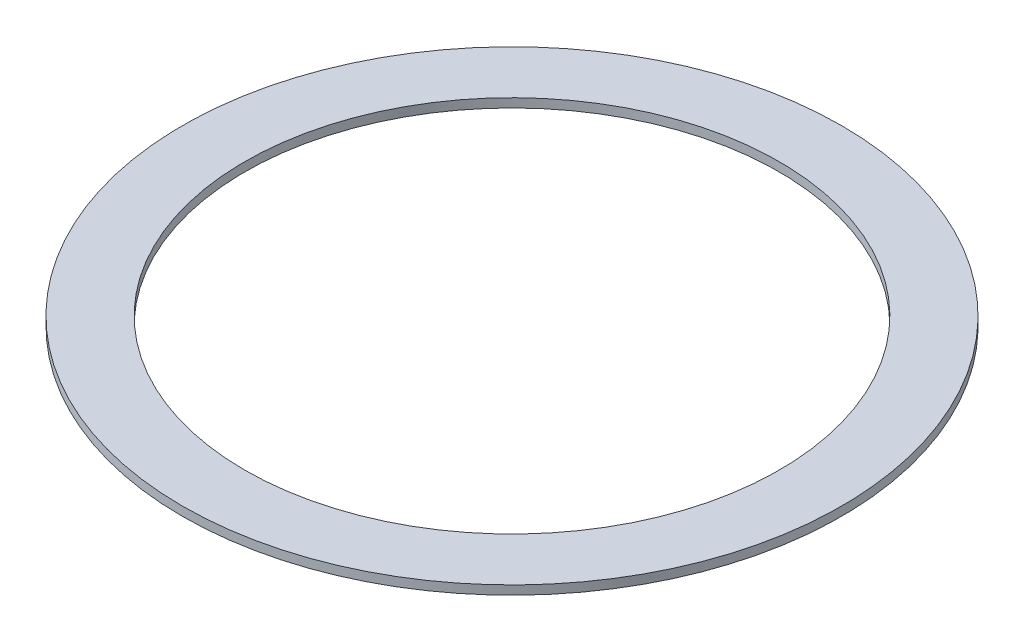
ISO-10303-21;
HEADER;
FILE_DESCRIPTION(('STEP AP214'),'2;1');
FILE_NAME('part.step','',(''),(''),'','','');
FILE_SCHEMA(('AUTOMOTIVE_DESIGN { 1 0 10303 214 1 1 1 1 }'));
ENDSEC;
DATA;
#1=APPLICATION_CONTEXT('core data for automotive mechanical design processes');
#2=APPLICATION_PROTOCOL_DEFINITION('international standard','automotive_design',2000,#1);
#3=PRODUCT_CONTEXT('',#1,'mechanical');
#4=PRODUCT('Part','Part','',(#3));
#5=PRODUCT_RELATED_PRODUCT_CATEGORY('part','',(#4));
#6=PRODUCT_DEFINITION_FORMATION('','',#4);
#7=PRODUCT_DEFINITION_CONTEXT('part definition',#1,'design');
#8=PRODUCT_DEFINITION('design','',#6,#7);
#9=PRODUCT_DEFINITION_SHAPE('','',#8);
#10=(LENGTH_UNIT() NAMED_UNIT(*) SI_UNIT(.MILLI.,.METRE.));
#11=(NAMED_UNIT(*) PLANE_ANGLE_UNIT() SI_UNIT($,.RADIAN.));
#12=(NAMED_UNIT(*) SI_UNIT($,.STERADIAN.) SOLID_ANGLE_UNIT());
#13=UNCERTAINTY_MEASURE_WITH_UNIT(LENGTH_MEASURE(1.E-05),#10,'distance_accuracy_value','');
#14=(GEOMETRIC_REPRESENTATION_CONTEXT(3) GLOBAL_UNCERTAINTY_ASSIGNED_CONTEXT((#13)) GLOBAL_UNIT_ASSIGNED_CONTEXT((#10,
#11,#12)) REPRESENTATION_CONTEXT('',''));
#15=CARTESIAN_POINT('',(0.,0.,0.));
#16=DIRECTION('',(0.,0.,1.));
#17=DIRECTION('',(1.,0.,0.));
#18=AXIS2_PLACEMENT_3D('',#15,#16,#17);
#19=CARTESIAN_POINT('',(0.,2.,0.));
#20=DIRECTION('',(0.,1.,0.));
#21=DIRECTION('',(0.,0.,1.));
#22=AXIS2_PLACEMENT_3D('',#19,#20,#21);
#23=PLANE('',#22);
#24=CARTESIAN_POINT('',(0.,2.,0.));
#25=DIRECTION('',(0.,1.,0.));
#26=DIRECTION('',(0.,0.,1.));
#27=AXIS2_PLACEMENT_3D('',#24,#25,#26);
#28=CIRCLE('',#27,74.);
#29=CARTESIAN_POINT('',(0.,2.,74.));
#30=VERTEX_POINT('',#29);
#31=EDGE_CURVE('E10',#30,#30,#28,.T.);
#32=ORIENTED_EDGE('',*,*,#31,.T.);
#33=EDGE_LOOP('',(#32));
#34=FACE_BOUND('',#33,.T.);
#35=CARTESIAN_POINT('',(0.,2.,0.));
#36=DIRECTION('',(0.,1.,0.));
#37=DIRECTION('',(0.,0.,1.));
#38=AXIS2_PLACEMENT_3D('',#35,#36,#37);
#39=CIRCLE('',#38,60.);
#40=CARTESIAN_POINT('',(0.,2.,60.));
#41=VERTEX_POINT('',#40);
#42=EDGE_CURVE('E45',#41,#41,#39,.T.);
#43=ORIENTED_EDGE('',*,*,#42,.F.);
#44=EDGE_LOOP('',(#43));
#45=FACE_BOUND('',#44,.T.);
#46=ADVANCED_FACE('F34',(#34,#45),#23,.T.);
#47=CARTESIAN_POINT('',(0.,0.,0.));
#48=DIRECTION('',(0.,1.,0.));
#49=DIRECTION('',(0.,0.,1.));
#50=AXIS2_PLACEMENT_3D('',#47,#48,#49);
#51=PLANE('',#50);
#52=CARTESIAN_POINT('',(0.,0.,0.));
#53=DIRECTION('',(0.,1.,0.));
#54=DIRECTION('',(0.,0.,1.));
#55=AXIS2_PLACEMENT_3D('',#52,#53,#54);
#56=CIRCLE('',#55,74.);
#57=CARTESIAN_POINT('',(0.,0.,74.));
#58=VERTEX_POINT('',#57);
#59=EDGE_CURVE('E38',#58,#58,#56,.T.);
#60=ORIENTED_EDGE('',*,*,#59,.F.);
#61=EDGE_LOOP('',(#60));
#62=FACE_BOUND('',#61,.T.);
#63=CARTESIAN_POINT('',(0.,0.,0.));
#64=DIRECTION('',(0.,1.,0.));
#65=DIRECTION('',(0.,0.,1.));
#66=AXIS2_PLACEMENT_3D('',#63,#64,#65);
#67=CIRCLE('',#66,60.);
#68=CARTESIAN_POINT('',(0.,0.,60.));
#69=VERTEX_POINT('',#68);
#70=EDGE_CURVE('E47',#69,#69,#67,.T.);
#71=ORIENTED_EDGE('',*,*,#70,.T.);
#72=EDGE_LOOP('',(#71));
#73=FACE_BOUND('',#72,.T.);
#74=ADVANCED_FACE('F57',(#62,#73),#51,.F.);
#75=CARTESIAN_POINT('',(0.,2.,0.));
#76=DIRECTION('',(0.,-1.,0.));
#77=DIRECTION('',(0.,0.,-1.));
#78=AXIS2_PLACEMENT_3D('',#75,#76,#77);
#79=CYLINDRICAL_SURFACE('',#78,74.);
#80=ORIENTED_EDGE('',*,*,#31,.F.);
#81=EDGE_LOOP('',(#80));
#82=FACE_BOUND('',#81,.T.);
#83=ORIENTED_EDGE('',*,*,#59,.T.);
#84=EDGE_LOOP('',(#83));
#85=FACE_BOUND('',#84,.T.);
#86=ADVANCED_FACE('F36',(#82,#85),#79,.T.);
#87=CARTESIAN_POINT('',(0.,2.,0.));
#88=DIRECTION('',(0.,-1.,0.));
#89=DIRECTION('',(0.,0.,-1.));
#90=AXIS2_PLACEMENT_3D('',#87,#88,#89);
#91=CYLINDRICAL_SURFACE('',#90,60.);
#92=ORIENTED_EDGE('',*,*,#42,.T.);
#93=EDGE_LOOP('',(#92));
#94=FACE_BOUND('',#93,.T.);
#95=ORIENTED_EDGE('',*,*,#70,.F.);
#96=EDGE_LOOP('',(#95));
#97=FACE_BOUND('',#96,.T.);
#98=ADVANCED_FACE('F53',(#94,#97),#91,.F.);
#99=CLOSED_SHELL('',(#46,#74,#86,#98));
#100=MANIFOLD_SOLID_BREP('B2',#99);
#101=ADVANCED_BREP_SHAPE_REPRESENTATION('',(#18,#100),#14);
#102=SHAPE_DEFINITION_REPRESENTATION(#9,#101);
ENDSEC;
END-ISO-10303-21;
